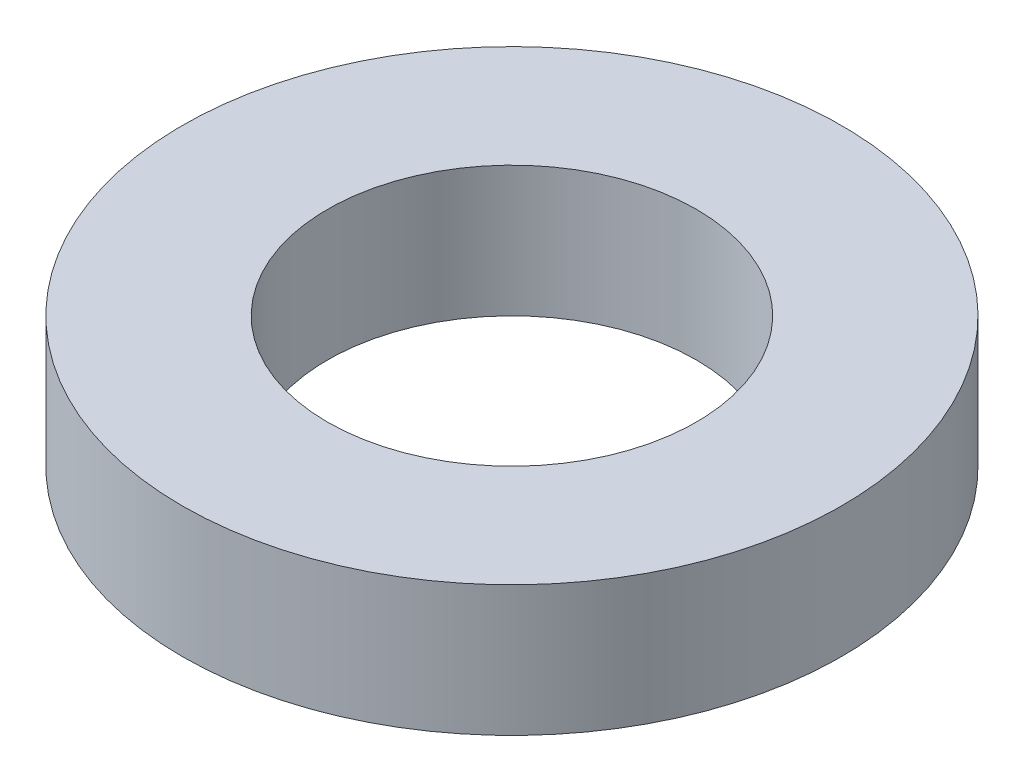
ISO-10303-21;
HEADER;
FILE_DESCRIPTION(('STEP AP214'),'2;1');
FILE_NAME('part.step','',(''),(''),'','','');
FILE_SCHEMA(('AUTOMOTIVE_DESIGN { 1 0 10303 214 1 1 1 1 }'));
ENDSEC;
DATA;
#1=APPLICATION_CONTEXT('core data for automotive mechanical design processes');
#2=APPLICATION_PROTOCOL_DEFINITION('international standard','automotive_design',2000,#1);
#3=PRODUCT_CONTEXT('',#1,'mechanical');
#4=PRODUCT('Part','Part','',(#3));
#5=PRODUCT_RELATED_PRODUCT_CATEGORY('part','',(#4));
#6=PRODUCT_DEFINITION_FORMATION('','',#4);
#7=PRODUCT_DEFINITION_CONTEXT('part definition',#1,'design');
#8=PRODUCT_DEFINITION('design','',#6,#7);
#9=PRODUCT_DEFINITION_SHAPE('','',#8);
#10=(LENGTH_UNIT() NAMED_UNIT(*) SI_UNIT(.MILLI.,.METRE.));
#11=(NAMED_UNIT(*) PLANE_ANGLE_UNIT() SI_UNIT($,.RADIAN.));
#12=(NAMED_UNIT(*) SI_UNIT($,.STERADIAN.) SOLID_ANGLE_UNIT());
#13=UNCERTAINTY_MEASURE_WITH_UNIT(LENGTH_MEASURE(1.E-05),#10,'distance_accuracy_value','');
#14=(GEOMETRIC_REPRESENTATION_CONTEXT(3) GLOBAL_UNCERTAINTY_ASSIGNED_CONTEXT((#13)) GLOBAL_UNIT_ASSIGNED_CONTEXT((#10,
#11,#12)) REPRESENTATION_CONTEXT('',''));
#15=CARTESIAN_POINT('',(0.,0.,0.));
#16=DIRECTION('',(0.,0.,1.));
#17=DIRECTION('',(1.,0.,0.));
#18=AXIS2_PLACEMENT_3D('',#15,#16,#17);
#19=CARTESIAN_POINT('',(0.,50.,0.));
#20=DIRECTION('',(0.,-1.,0.));
#21=DIRECTION('',(0.,0.,-1.));
#22=AXIS2_PLACEMENT_3D('',#19,#20,#21);
#23=CYLINDRICAL_SURFACE('',#22,126.270000063);
#24=CARTESIAN_POINT('',(0.,50.,0.));
#25=DIRECTION('',(0.,1.,0.));
#26=DIRECTION('',(0.,0.,1.));
#27=AXIS2_PLACEMENT_3D('',#24,#25,#26);
#28=CIRCLE('',#27,126.270000063);
#29=CARTESIAN_POINT('',(0.,50.,126.270000063));
#30=VERTEX_POINT('',#29);
#31=EDGE_CURVE('E10',#30,#30,#28,.T.);
#32=ORIENTED_EDGE('',*,*,#31,.F.);
#33=EDGE_LOOP('',(#32));
#34=FACE_BOUND('',#33,.T.);
#35=CARTESIAN_POINT('',(0.,0.,0.));
#36=DIRECTION('',(0.,1.,0.));
#37=DIRECTION('',(0.,0.,1.));
#38=AXIS2_PLACEMENT_3D('',#35,#36,#37);
#39=CIRCLE('',#38,126.270000063);
#40=CARTESIAN_POINT('',(0.,0.,126.270000063));
#41=VERTEX_POINT('',#40);
#42=EDGE_CURVE('E40',#41,#41,#39,.T.);
#43=ORIENTED_EDGE('',*,*,#42,.T.);
#44=EDGE_LOOP('',(#43));
#45=FACE_BOUND('',#44,.T.);
#46=ADVANCED_FACE('F37',(#34,#45),#23,.T.);
#47=CARTESIAN_POINT('',(0.,50.,0.));
#48=DIRECTION('',(0.,1.,0.));
#49=DIRECTION('',(0.,0.,1.));
#50=AXIS2_PLACEMENT_3D('',#47,#48,#49);
#51=PLANE('',#50);
#52=CARTESIAN_POINT('',(0.,50.,0.));
#53=DIRECTION('',(0.,1.,0.));
#54=DIRECTION('',(0.,0.,1.));
#55=AXIS2_PLACEMENT_3D('',#52,#53,#54);
#56=CIRCLE('',#55,70.6458431961005);
#57=CARTESIAN_POINT('',(0.,50.,70.6458431961005));
#58=VERTEX_POINT('',#57);
#59=EDGE_CURVE('E51',#58,#58,#56,.T.);
#60=ORIENTED_EDGE('',*,*,#59,.F.);
#61=EDGE_LOOP('',(#60));
#62=FACE_BOUND('',#61,.T.);
#63=ORIENTED_EDGE('',*,*,#31,.T.);
#64=EDGE_LOOP('',(#63));
#65=FACE_BOUND('',#64,.T.);
#66=ADVANCED_FACE('F68',(#62,#65),#51,.T.);
#67=CARTESIAN_POINT('',(0.,0.,0.));
#68=DIRECTION('',(0.,1.,0.));
#69=DIRECTION('',(0.,0.,1.));
#70=AXIS2_PLACEMENT_3D('',#67,#68,#69);
#71=PLANE('',#70);
#72=CARTESIAN_POINT('',(0.,0.,0.));
#73=DIRECTION('',(0.,1.,0.));
#74=DIRECTION('',(0.,0.,1.));
#75=AXIS2_PLACEMENT_3D('',#72,#73,#74);
#76=CIRCLE('',#75,70.6458431961005);
#77=CARTESIAN_POINT('',(0.,0.,70.6458431961005));
#78=VERTEX_POINT('',#77);
#79=EDGE_CURVE('E49',#78,#78,#76,.T.);
#80=ORIENTED_EDGE('',*,*,#79,.T.);
#81=EDGE_LOOP('',(#80));
#82=FACE_BOUND('',#81,.T.);
#83=ORIENTED_EDGE('',*,*,#42,.F.);
#84=EDGE_LOOP('',(#83));
#85=FACE_BOUND('',#84,.T.);
#86=ADVANCED_FACE('F59',(#82,#85),#71,.F.);
#87=CARTESIAN_POINT('',(0.,0.,0.));
#88=DIRECTION('',(0.,1.,0.));
#89=DIRECTION('',(0.,0.,1.));
#90=AXIS2_PLACEMENT_3D('',#87,#88,#89);
#91=CYLINDRICAL_SURFACE('',#90,70.6458431961005);
#92=ORIENTED_EDGE('',*,*,#79,.F.);
#93=EDGE_LOOP('',(#92));
#94=FACE_BOUND('',#93,.T.);
#95=ORIENTED_EDGE('',*,*,#59,.T.);
#96=EDGE_LOOP('',(#95));
#97=FACE_BOUND('',#96,.T.);
#98=ADVANCED_FACE('F62',(#94,#97),#91,.F.);
#99=CLOSED_SHELL('',(#46,#66,#86,#98));
#100=MANIFOLD_SOLID_BREP('B2',#99);
#101=ADVANCED_BREP_SHAPE_REPRESENTATION('',(#18,#100),#14);
#102=SHAPE_DEFINITION_REPRESENTATION(#9,#101);
ENDSEC;
END-ISO-10303-21;
